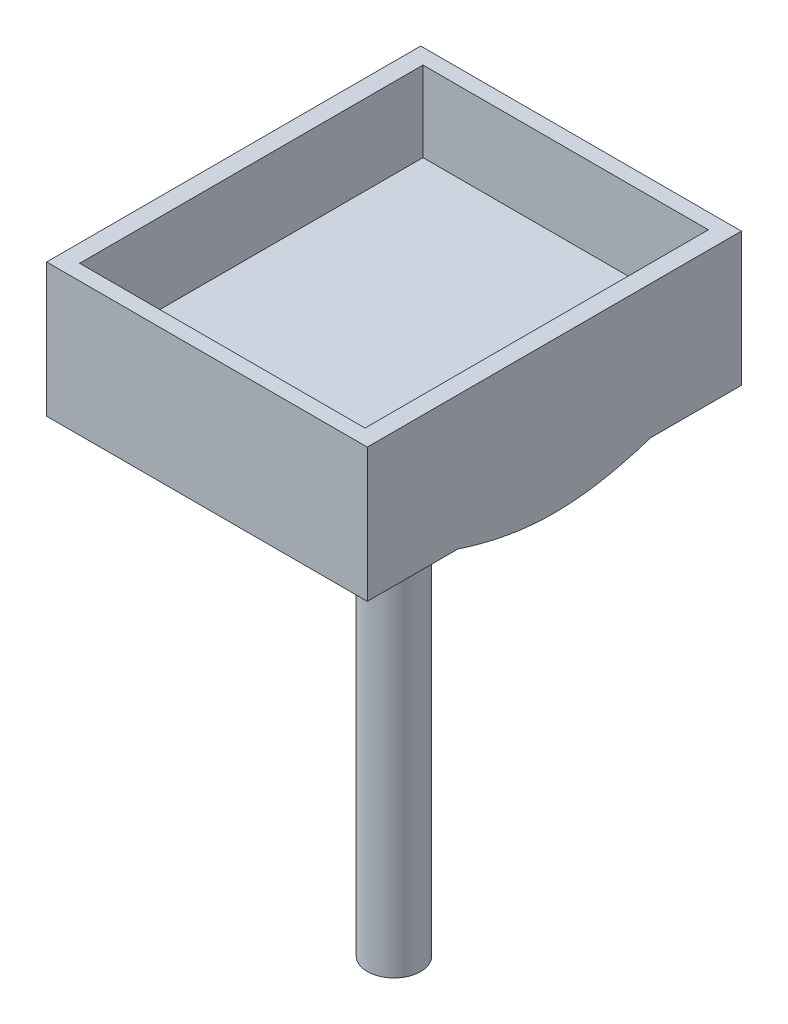
ISO-10303-21;
HEADER;
FILE_DESCRIPTION(('STEP AP214'),'2;1');
FILE_NAME('part.step','',(''),(''),'','','');
FILE_SCHEMA(('AUTOMOTIVE_DESIGN { 1 0 10303 214 1 1 1 1 }'));
ENDSEC;
DATA;
#1=APPLICATION_CONTEXT('core data for automotive mechanical design processes');
#2=APPLICATION_PROTOCOL_DEFINITION('international standard','automotive_design',2000,#1);
#3=PRODUCT_CONTEXT('',#1,'mechanical');
#4=PRODUCT('Part','Part','',(#3));
#5=PRODUCT_RELATED_PRODUCT_CATEGORY('part','',(#4));
#6=PRODUCT_DEFINITION_FORMATION('','',#4);
#7=PRODUCT_DEFINITION_CONTEXT('part definition',#1,'design');
#8=PRODUCT_DEFINITION('design','',#6,#7);
#9=PRODUCT_DEFINITION_SHAPE('','',#8);
#10=(LENGTH_UNIT() NAMED_UNIT(*) SI_UNIT(.MILLI.,.METRE.));
#11=(NAMED_UNIT(*) PLANE_ANGLE_UNIT() SI_UNIT($,.RADIAN.));
#12=(NAMED_UNIT(*) SI_UNIT($,.STERADIAN.) SOLID_ANGLE_UNIT());
#13=UNCERTAINTY_MEASURE_WITH_UNIT(LENGTH_MEASURE(1.E-05),#10,'distance_accuracy_value','');
#14=(GEOMETRIC_REPRESENTATION_CONTEXT(3) GLOBAL_UNCERTAINTY_ASSIGNED_CONTEXT((#13)) GLOBAL_UNIT_ASSIGNED_CONTEXT((#10,
#11,#12)) REPRESENTATION_CONTEXT('',''));
#15=CARTESIAN_POINT('',(0.,0.,0.));
#16=DIRECTION('',(0.,0.,1.));
#17=DIRECTION('',(1.,0.,0.));
#18=AXIS2_PLACEMENT_3D('',#15,#16,#17);
#19=CARTESIAN_POINT('',(0.,90.,0.));
#20=DIRECTION('',(0.,-1.,0.));
#21=DIRECTION('',(0.,0.,-1.));
#22=AXIS2_PLACEMENT_3D('',#19,#20,#21);
#23=CYLINDRICAL_SURFACE('',#22,5.);
#24=CARTESIAN_POINT('',(0.,70.95,0.));
#25=DIRECTION('',(0.,1.,0.));
#26=DIRECTION('',(0.,0.,1.));
#27=AXIS2_PLACEMENT_3D('',#24,#25,#26);
#28=CIRCLE('',#27,5.);
#29=CARTESIAN_POINT('',(0.,70.95,-5.));
#30=VERTEX_POINT('',#29);
#31=EDGE_CURVE('E189',#30,#30,#28,.T.);
#32=CARTESIAN_POINT('',(0.,0.,0.));
#33=DIRECTION('',(0.,1.,0.));
#34=DIRECTION('',(0.,0.,1.));
#35=AXIS2_PLACEMENT_3D('',#32,#33,#34);
#36=CIRCLE('',#35,5.);
#37=CARTESIAN_POINT('',(0.,0.,-5.));
#38=VERTEX_POINT('',#37);
#39=EDGE_CURVE('E234',#38,#38,#36,.T.);
#40=CARTESIAN_POINT('',(0.,70.95,-5.));
#41=CARTESIAN_POINT('',(0.,70.2109375,-5.));
#42=CARTESIAN_POINT('',(0.,69.471875,-5.));
#43=CARTESIAN_POINT('',(0.,67.99375,-5.));
#44=CARTESIAN_POINT('',(0.,67.2546875,-5.));
#45=CARTESIAN_POINT('',(0.,65.7765625,-5.));
#46=CARTESIAN_POINT('',(0.,65.0375,-5.));
#47=CARTESIAN_POINT('',(0.,63.559375,-5.));
#48=CARTESIAN_POINT('',(0.,62.8203125,-5.));
#49=CARTESIAN_POINT('',(0.,61.3421875,-5.));
#50=CARTESIAN_POINT('',(0.,60.603125,-5.));
#51=CARTESIAN_POINT('',(0.,59.125,-5.));
#52=CARTESIAN_POINT('',(0.,58.3859375,-5.));
#53=CARTESIAN_POINT('',(0.,56.9078125,-5.));
#54=CARTESIAN_POINT('',(0.,56.16875,-5.));
#55=CARTESIAN_POINT('',(0.,54.690625,-5.));
#56=CARTESIAN_POINT('',(0.,53.9515625,-5.));
#57=CARTESIAN_POINT('',(0.,52.4734375,-5.));
#58=CARTESIAN_POINT('',(0.,51.734375,-5.));
#59=CARTESIAN_POINT('',(0.,50.25625,-5.));
#60=CARTESIAN_POINT('',(0.,49.5171875,-5.));
#61=CARTESIAN_POINT('',(0.,48.0390625,-5.));
#62=CARTESIAN_POINT('',(0.,47.3,-5.));
#63=CARTESIAN_POINT('',(0.,45.821875,-5.));
#64=CARTESIAN_POINT('',(0.,45.0828125,-5.));
#65=CARTESIAN_POINT('',(0.,43.6046875,-5.));
#66=CARTESIAN_POINT('',(0.,42.865625,-5.));
#67=CARTESIAN_POINT('',(0.,41.3875,-5.));
#68=CARTESIAN_POINT('',(0.,40.6484375,-5.));
#69=CARTESIAN_POINT('',(0.,39.1703125,-5.));
#70=CARTESIAN_POINT('',(0.,38.43125,-5.));
#71=CARTESIAN_POINT('',(0.,36.953125,-5.));
#72=CARTESIAN_POINT('',(0.,36.2140625,-5.));
#73=CARTESIAN_POINT('',(0.,34.7359375,-5.));
#74=CARTESIAN_POINT('',(0.,33.996875,-5.));
#75=CARTESIAN_POINT('',(0.,32.51875,-5.));
#76=CARTESIAN_POINT('',(0.,31.7796875,-5.));
#77=CARTESIAN_POINT('',(0.,30.3015625,-5.));
#78=CARTESIAN_POINT('',(0.,29.5625,-5.));
#79=CARTESIAN_POINT('',(0.,28.084375,-5.));
#80=CARTESIAN_POINT('',(0.,27.3453125,-5.));
#81=CARTESIAN_POINT('',(0.,25.8671875,-5.));
#82=CARTESIAN_POINT('',(0.,25.128125,-5.));
#83=CARTESIAN_POINT('',(0.,23.65,-5.));
#84=CARTESIAN_POINT('',(0.,22.9109375,-5.));
#85=CARTESIAN_POINT('',(0.,21.4328125,-5.));
#86=CARTESIAN_POINT('',(0.,20.69375,-5.));
#87=CARTESIAN_POINT('',(0.,19.215625,-5.));
#88=CARTESIAN_POINT('',(0.,18.4765625,-5.));
#89=CARTESIAN_POINT('',(0.,16.9984375,-5.));
#90=CARTESIAN_POINT('',(0.,16.259375,-5.));
#91=CARTESIAN_POINT('',(0.,14.78125,-5.));
#92=CARTESIAN_POINT('',(0.,14.0421875,-5.));
#93=CARTESIAN_POINT('',(0.,12.5640625,-5.));
#94=CARTESIAN_POINT('',(0.,11.825,-5.));
#95=CARTESIAN_POINT('',(0.,10.346875,-5.));
#96=CARTESIAN_POINT('',(0.,9.60781249999999,-5.));
#97=CARTESIAN_POINT('',(0.,8.1296875,-5.));
#98=CARTESIAN_POINT('',(0.,7.390625,-5.));
#99=CARTESIAN_POINT('',(0.,5.9125,-5.));
#100=CARTESIAN_POINT('',(0.,5.1734375,-5.));
#101=CARTESIAN_POINT('',(0.,3.6953125,-5.));
#102=CARTESIAN_POINT('',(0.,2.95624999999999,-5.));
#103=CARTESIAN_POINT('',(0.,1.47812499999998,-5.));
#104=CARTESIAN_POINT('',(0.,0.739062499999984,-5.));
#105=CARTESIAN_POINT('',(0.,0.,-5.));
#106=B_SPLINE_CURVE_WITH_KNOTS('',3,(#40,#41,#42,#43,#44,#45,#46,#47,#48,#49,#50,#51,#52,#53,
#54,#55,#56,#57,#58,#59,#60,#61,#62,#63,#64,#65,#66,#67,#68,#69,#70,#71,#72,#73,#74,#75,#76,#77,
#78,#79,#80,#81,#82,#83,#84,#85,#86,#87,#88,#89,#90,#91,#92,#93,#94,#95,#96,#97,#98,#99,#100,
#101,#102,#103,#104,#105),.UNSPECIFIED.,.F.,.F.,(4,2,2,2,2,2,2,2,2,2,2,2,2,2,2,2,2,2,2,2,2,2,2,
2,2,2,2,2,2,2,2,2,4),(0.,2.21718750000001,4.434375,6.6515625,8.86875000000001,11.0859375,
13.303125,15.5203125,17.7375,19.9546875,22.171875,24.3890625,26.60625,28.8234375,31.040625,
33.2578125,35.475,37.6921875,39.909375,42.1265625,44.34375,46.5609375,48.778125,50.9953125,
53.2125,55.4296875,57.646875,59.8640625,62.08125,64.2984375,66.515625,68.7328125,70.95),.UNSPECIFIED.);
#107=EDGE_CURVE('BSEAM44',#30,#38,#106,.T.);
#108=ORIENTED_EDGE('',*,*,#31,.F.);
#109=ORIENTED_EDGE('',*,*,#39,.T.);
#110=ORIENTED_EDGE('',*,*,#107,.T.);
#111=ORIENTED_EDGE('',*,*,#107,.F.);
#112=EDGE_LOOP('',(#108,#110,#109,#111));
#113=FACE_BOUND('',#112,.T.);
#114=ADVANCED_FACE('F44',(#113),#23,.T.);
#115=CARTESIAN_POINT('',(0.,0.,0.));
#116=DIRECTION('',(0.,1.,0.));
#117=DIRECTION('',(0.,0.,1.));
#118=AXIS2_PLACEMENT_3D('',#115,#116,#117);
#119=PLANE('',#118);
#120=ORIENTED_EDGE('',*,*,#39,.F.);
#121=EDGE_LOOP('',(#120));
#122=FACE_BOUND('',#121,.T.);
#123=ADVANCED_FACE('F276',(#122),#119,.F.);
#124=CARTESIAN_POINT('',(0.,90.,0.));
#125=DIRECTION('',(0.,1.,0.));
#126=DIRECTION('',(0.,0.,1.));
#127=AXIS2_PLACEMENT_3D('',#124,#125,#126);
#128=CONICAL_SURFACE('',#127,35.,1.00503829705281);
#129=CARTESIAN_POINT('',(-30.,138.673982891939,-107.546064802896));
#130=CARTESIAN_POINT('',(-30.,137.373767080057,-105.420227630996));
#131=CARTESIAN_POINT('',(-30.,136.075506407321,-103.293191662438));
#132=CARTESIAN_POINT('',(-30.,133.483819119817,-99.0361621358405));
#133=CARTESIAN_POINT('',(-30.,132.190392530082,-96.9061685625646));
#134=CARTESIAN_POINT('',(-30.,129.608933581953,-92.6420629487055));
#135=CARTESIAN_POINT('',(-30.,128.320902910074,-90.5079498866202));
#136=CARTESIAN_POINT('',(-30.,125.751884310078,-86.2354923701299));
#137=CARTESIAN_POINT('',(-30.,124.470896369152,-84.0971479234298));
#138=CARTESIAN_POINT('',(-30.,121.911755671328,-79.8054917864776));
#139=CARTESIAN_POINT('',(-30.,120.633642672995,-77.6521563703064));
#140=CARTESIAN_POINT('',(-30.,118.088388741257,-73.3390142348211));
#141=CARTESIAN_POINT('',(-30.,116.821247778676,-71.1792075327357));
#142=CARTESIAN_POINT('',(-30.,114.301150597366,-66.8518468219174));
#143=CARTESIAN_POINT('',(-30.,113.048191832849,-64.6842942985533));
#144=CARTESIAN_POINT('',(-30.,111.18239857315,-61.425163097025));
#145=CARTESIAN_POINT('',(-30.,110.562743253998,-60.3374885118703));
#146=CARTESIAN_POINT('',(-30.,109.328684553185,-58.1591648814117));
#147=CARTESIAN_POINT('',(-30.,108.714281163685,-57.0685158405509));
#148=CARTESIAN_POINT('',(-30.,107.299721209316,-54.5411103914377));
#149=CARTESIAN_POINT('',(-30.,106.501763644601,-53.103121481933));
#150=CARTESIAN_POINT('',(-30.,104.918620288696,-50.2201099023198));
#151=CARTESIAN_POINT('',(-30.,104.133434566112,-48.7750871944824));
#152=CARTESIAN_POINT('',(-30.,102.578546521247,-45.8759215035246));
#153=CARTESIAN_POINT('',(-30.,101.808851016936,-44.4217748585942));
#154=CARTESIAN_POINT('',(-30.,100.289301586826,-41.5031363796143));
#155=CARTESIAN_POINT('',(-30.,99.5394473915369,-40.0386446864158));
#156=CARTESIAN_POINT('',(-30.,98.4326839161197,-37.8304743921339));
#157=CARTESIAN_POINT('',(-30.,98.0662997976447,-37.0915411602742));
#158=CARTESIAN_POINT('',(-30.,97.3407725616416,-35.6101312234868));
#159=CARTESIAN_POINT('',(-30.,96.9816293821811,-34.8676545489336));
#160=CARTESIAN_POINT('',(-30.,96.2715481157527,-33.3787015052499));
#161=CARTESIAN_POINT('',(-30.,95.9206107712966,-32.6322247816259));
#162=CARTESIAN_POINT('',(-30.,95.2281546953222,-31.1349115943893));
#163=CARTESIAN_POINT('',(-30.,94.8866359393919,-30.3840751420828));
#164=CARTESIAN_POINT('',(-30.,94.2145879741199,-28.8779996527615));
#165=CARTESIAN_POINT('',(-30.,93.8840526759384,-28.1227633373314));
#166=CARTESIAN_POINT('',(-30.,93.2353864566478,-26.6069605863383));
#167=CARTESIAN_POINT('',(-30.,92.9172556902603,-25.8463940844314));
#168=CARTESIAN_POINT('',(-30.,92.2953518051474,-24.3195425653464));
#169=CARTESIAN_POINT('',(-30.,91.9915763720509,-23.5532584931813));
#170=CARTESIAN_POINT('',(-30.,91.400555795113,-22.0143614398676));
#171=CARTESIAN_POINT('',(-30.,91.1133099645154,-21.2417487231814));
#172=CARTESIAN_POINT('',(-30.,90.5444686320344,-19.6521515715014));
#173=CARTESIAN_POINT('',(-30.,90.2638176122865,-18.834827725387));
#174=CARTESIAN_POINT('',(-30.,89.7268654950292,-17.1921912632238));
#175=CARTESIAN_POINT('',(-30.,89.4705642120038,-16.3668787080921));
#176=CARTESIAN_POINT('',(-30.,88.9861192320895,-14.7080013730931));
#177=CARTESIAN_POINT('',(-30.,88.7579750269567,-13.8744367424716));
#178=CARTESIAN_POINT('',(-30.,88.3339775950481,-12.1990833924805));
#179=CARTESIAN_POINT('',(-30.,88.1381242674443,-11.357294698799));
#180=CARTESIAN_POINT('',(-30.,87.7850754199941,-9.67592676732105));
#181=CARTESIAN_POINT('',(-30.,87.627452413333,-8.83643794148996));
#182=CARTESIAN_POINT('',(-30.,87.3518856464695,-7.1509322859886));
#183=CARTESIAN_POINT('',(-30.,87.233941186104,-6.3049155717782));
#184=CARTESIAN_POINT('',(-30.,87.0411527273799,-4.60824286170311));
#185=CARTESIAN_POINT('',(-30.,86.9662934778702,-3.75758861518255));
#186=CARTESIAN_POINT('',(-30.,86.8619811824506,-2.0534800256));
#187=CARTESIAN_POINT('',(-30.,86.8325277791628,-1.20002570462966));
#188=CARTESIAN_POINT('',(-30.,86.819960595158,0.514235974965454));
#189=CARTESIAN_POINT('',(-30.,86.8372291496917,1.37504618969294));
#190=CARTESIAN_POINT('',(-30.,86.9183332568906,3.09445456408258));
#191=CARTESIAN_POINT('',(-30.,86.982169251922,3.95305270265343));
#192=CARTESIAN_POINT('',(-30.,87.1543422034353,5.66599994548119));
#193=CARTESIAN_POINT('',(-30.,87.2626929047508,6.52034765479255));
#194=CARTESIAN_POINT('',(-30.,87.5206422729315,8.22275296406229));
#195=CARTESIAN_POINT('',(-30.,87.6702417291997,9.07081044332166));
#196=CARTESIAN_POINT('',(-30.,88.0088061100727,10.769867027638));
#197=CARTESIAN_POINT('',(-30.,88.1982343742976,11.6207731172736));
#198=CARTESIAN_POINT('',(-30.,88.6109233998695,13.3142891867518));
#199=CARTESIAN_POINT('',(-30.,88.8341845573266,14.1568990693405));
#200=CARTESIAN_POINT('',(-30.,89.3102460858606,15.8337176797129));
#201=CARTESIAN_POINT('',(-30.,89.5630471159211,16.667926219626));
#202=CARTESIAN_POINT('',(-30.,89.9613974359033,17.9130324447111));
#203=CARTESIAN_POINT('',(-30.,90.0973705826754,18.3270284657605));
#204=CARTESIAN_POINT('',(-30.,90.3752534112985,19.1530266681292));
#205=CARTESIAN_POINT('',(-30.,90.5171631180277,19.5650288410849));
#206=CARTESIAN_POINT('',(-30.,90.9300037728857,20.7380701544529));
#207=CARTESIAN_POINT('',(-30.,91.2076373284959,21.4967555419285));
#208=CARTESIAN_POINT('',(-30.,91.7793179556847,23.0079372823433));
#209=CARTESIAN_POINT('',(-30.,92.0733659480234,23.7604332853698));
#210=CARTESIAN_POINT('',(-30.,92.6757715016487,25.2598555566361));
#211=CARTESIAN_POINT('',(-30.,92.9841321786235,26.0067805706795));
#212=CARTESIAN_POINT('',(-30.,93.6132345618857,27.4953724681398));
#213=CARTESIAN_POINT('',(-30.,93.9339760668325,28.2370394368325));
#214=CARTESIAN_POINT('',(-30.,94.5865486740753,29.7162832968331));
#215=CARTESIAN_POINT('',(-30.,94.9183896779142,30.4538558127956));
#216=CARTESIAN_POINT('',(-30.,95.5915157609574,31.9246755314862));
#217=CARTESIAN_POINT('',(-30.,95.9328008743814,32.6579227185303));
#218=CARTESIAN_POINT('',(-30.,96.6236073371594,34.1204266929669));
#219=CARTESIAN_POINT('',(-30.,96.9731278012806,34.8496838989595));
#220=CARTESIAN_POINT('',(-30.,97.6794494374746,36.3046668029561));
#221=CARTESIAN_POINT('',(-30.,98.0362506747167,37.0303924692776));
#222=CARTESIAN_POINT('',(-30.,99.1182250744464,39.2067517808444));
#223=CARTESIAN_POINT('',(-30.,99.8530733837692,40.6525792914777));
#224=CARTESIAN_POINT('',(-30.,101.342975423737,43.5337771462784));
#225=CARTESIAN_POINT('',(-30.,102.098029522899,44.969147299114));
#226=CARTESIAN_POINT('',(-30.,103.623874357831,47.8305441746947));
#227=CARTESIAN_POINT('',(-30.,104.394656852996,49.2565752980922));
#228=CARTESIAN_POINT('',(-30.,105.949232868956,52.1015032032319));
#229=CARTESIAN_POINT('',(-30.,106.733026297119,53.5204000356735));
#230=CARTESIAN_POINT('',(-30.,108.312416723175,56.3543217551546));
#231=CARTESIAN_POINT('',(-30.,109.108029300827,57.7693379500682));
#232=CARTESIAN_POINT('',(-30.,110.70808833097,60.5943646793998));
#233=CARTESIAN_POINT('',(-30.,111.512534793968,62.0043752078616));
#234=CARTESIAN_POINT('',(-30.,113.128898111183,64.820315777407));
#235=CARTESIAN_POINT('',(-30.,113.940815795192,66.2262453418594));
#236=CARTESIAN_POINT('',(-30.,115.570875013679,69.0344886251501));
#237=CARTESIAN_POINT('',(-30.,116.389016544384,70.4368023461797));
#238=CARTESIAN_POINT('',(-30.,118.029405342153,73.2363033602978));
#239=CARTESIAN_POINT('',(-30.,118.851644967156,74.6334951331697));
#240=CARTESIAN_POINT('',(-30.,120.500653448375,77.4252040307897));
#241=CARTESIAN_POINT('',(-30.,121.32742230948,78.8197211526492));
#242=CARTESIAN_POINT('',(-30.,123.813510572198,82.9997124156217));
#243=CARTESIAN_POINT('',(-30.,125.47866490596,85.7817171394603));
#244=CARTESIAN_POINT('',(-30.,128.104916287672,90.1483694792077));
#245=CARTESIAN_POINT('',(-30.,129.062041832029,91.7354101985785));
#246=CARTESIAN_POINT('',(-30.,130.979880129824,94.9078556416213));
#247=CARTESIAN_POINT('',(-30.,131.940593706714,96.493259867635));
#248=CARTESIAN_POINT('',(-30.,133.862094328056,99.6576405827623));
#249=CARTESIAN_POINT('',(-30.,134.822872836017,101.236622257481));
#250=CARTESIAN_POINT('',(-30.,136.74673075746,104.392647353121));
#251=CARTESIAN_POINT('',(-30.,137.709809542568,105.969691157057));
#252=CARTESIAN_POINT('',(-30.,138.673982891939,107.546064802896));
#253=B_SPLINE_CURVE_WITH_KNOTS('',3,(#129,#130,#131,#132,#133,#134,#135,#136,#137,#138,#139,
#140,#141,#142,#143,#144,#145,#146,#147,#148,#149,#150,#151,#152,#153,#154,#155,#156,#157,#158,
#159,#160,#161,#162,#163,#164,#165,#166,#167,#168,#169,#170,#171,#172,#173,#174,#175,#176,#177,
#178,#179,#180,#181,#182,#183,#184,#185,#186,#187,#188,#189,#190,#191,#192,#193,#194,#195,#196,
#197,#198,#199,#200,#201,#202,#203,#204,#205,#206,#207,#208,#209,#210,#211,#212,#213,#214,#215,
#216,#217,#218,#219,#220,#221,#222,#223,#224,#225,#226,#227,#228,#229,#230,#231,#232,#233,#234,
#235,#236,#237,#238,#239,#240,#241,#242,#243,#244,#245,#246,#247,#248,#249,#250,#251,#252),
.UNSPECIFIED.,.F.,.F.,(4,2,2,2,2,2,2,2,2,2,2,2,2,2,2,2,2,2,2,2,2,2,2,2,2,2,2,2,2,2,2,2,2,2,2,2,
2,2,2,2,2,2,2,2,2,2,2,2,2,2,2,2,2,2,2,2,2,2,2,2,2,4),(0.,7.47581062568457,14.951659907773,
22.4296934938279,29.9077134755251,37.4199329238096,44.932132389725,52.4429612749093,
56.19835586837,59.9537448552788,64.8873451287647,69.8209718951688,74.756724678917,
79.6924103899499,82.1667143389763,84.6409971161309,87.1155029211449,89.5900023118848,
92.0631062316485,94.5362409885485,97.0089756560597,99.4816075144716,102.073775418383,
104.665923571482,107.258024928674,109.850118191898,112.411731708521,114.973300020834,
117.533961039672,120.094601904101,122.676260252566,125.257943125743,127.840423746567,
130.422953793351,133.03737760614,135.651832030548,138.26634479006,139.573569632637,
140.880799953908,143.304226348851,145.727788821621,148.151881370158,150.575934514016,
153.002210997089,155.428496272623,157.854521921547,160.2805692951,165.145909882523,
170.011339265599,174.874281818126,179.737189763408,184.607206388415,189.477228806296,
194.347798803858,199.218365849041,204.081894193652,208.945427787746,218.672179485708,
224.232130769519,229.793447873189,235.338398703333,240.881977063949),.UNSPECIFIED.);
#254=CARTESIAN_POINT('',(-30.,90.,-18.0277563773199));
#255=VERTEX_POINT('',#254);
#256=CARTESIAN_POINT('',(-30.,90.,18.02775637732));
#257=VERTEX_POINT('',#256);
#258=EDGE_CURVE('E11',#255,#257,#253,.T.);
#259=ORIENTED_EDGE('',*,*,#258,.F.);
#260=CARTESIAN_POINT('',(0.,90.,0.));
#261=DIRECTION('',(0.,-1.,0.));
#262=DIRECTION('',(0.,0.,-1.));
#263=AXIS2_PLACEMENT_3D('',#260,#261,#262);
#264=CIRCLE('',#263,35.);
#265=CARTESIAN_POINT('',(0.,90.,-35.));
#266=VERTEX_POINT('',#265);
#267=EDGE_CURVE('E249',#255,#266,#264,.T.);
#268=ORIENTED_EDGE('',*,*,#267,.T.);
#269=CARTESIAN_POINT('',(30.,90.,-18.02775637732));
#270=VERTEX_POINT('',#269);
#271=EDGE_CURVE('E248',#266,#270,#264,.T.);
#272=ORIENTED_EDGE('',*,*,#271,.T.);
#273=CARTESIAN_POINT('',(30.,138.673982891939,107.546064802896));
#274=CARTESIAN_POINT('',(30.,137.373767080057,105.420227630996));
#275=CARTESIAN_POINT('',(30.,136.075506407321,103.293191662438));
#276=CARTESIAN_POINT('',(30.,133.483819119817,99.0361621358405));
#277=CARTESIAN_POINT('',(30.,132.190392530082,96.9061685625646));
#278=CARTESIAN_POINT('',(30.,129.608933581953,92.6420629487055));
#279=CARTESIAN_POINT('',(30.,128.320902910074,90.5079498866203));
#280=CARTESIAN_POINT('',(30.,125.751884310078,86.2354923701299));
#281=CARTESIAN_POINT('',(30.,124.470896369152,84.0971479234299));
#282=CARTESIAN_POINT('',(30.,121.911755671328,79.8054917864776));
#283=CARTESIAN_POINT('',(30.,120.633642672995,77.6521563703065));
#284=CARTESIAN_POINT('',(30.,118.088388741257,73.3390142348211));
#285=CARTESIAN_POINT('',(30.,116.821247778676,71.1792075327358));
#286=CARTESIAN_POINT('',(30.,114.301150597366,66.8518468219174));
#287=CARTESIAN_POINT('',(30.,113.048191832849,64.6842942985533));
#288=CARTESIAN_POINT('',(30.,111.18239857315,61.425163097025));
#289=CARTESIAN_POINT('',(30.,110.562743253998,60.3374885118703));
#290=CARTESIAN_POINT('',(30.,109.328684553185,58.1591648814117));
#291=CARTESIAN_POINT('',(30.,108.714281163685,57.0685158405509));
#292=CARTESIAN_POINT('',(30.,107.299721209316,54.5411103914377));
#293=CARTESIAN_POINT('',(30.,106.501763644601,53.103121481933));
#294=CARTESIAN_POINT('',(30.,104.918620288696,50.2201099023198));
#295=CARTESIAN_POINT('',(30.,104.133434566112,48.7750871944824));
#296=CARTESIAN_POINT('',(30.,102.578546521247,45.8759215035246));
#297=CARTESIAN_POINT('',(30.,101.808851016936,44.4217748585941));
#298=CARTESIAN_POINT('',(30.,100.289301586826,41.5031363796143));
#299=CARTESIAN_POINT('',(30.,99.5394473915369,40.0386446864158));
#300=CARTESIAN_POINT('',(30.,98.4326839161197,37.8304743921338));
#301=CARTESIAN_POINT('',(30.,98.0662997976447,37.0915411602742));
#302=CARTESIAN_POINT('',(30.,97.3407725616416,35.6101312234868));
#303=CARTESIAN_POINT('',(30.,96.9816293821811,34.8676545489336));
#304=CARTESIAN_POINT('',(30.,96.2715481157527,33.3787015052499));
#305=CARTESIAN_POINT('',(30.,95.9206107712966,32.6322247816259));
#306=CARTESIAN_POINT('',(30.,95.2281546953222,31.1349115943893));
#307=CARTESIAN_POINT('',(30.,94.8866359393919,30.3840751420827));
#308=CARTESIAN_POINT('',(30.,94.2145879741199,28.8779996527614));
#309=CARTESIAN_POINT('',(30.,93.8840526759384,28.1227633373314));
#310=CARTESIAN_POINT('',(30.,93.2353864566477,26.6069605863382));
#311=CARTESIAN_POINT('',(30.,92.9172556902603,25.8463940844313));
#312=CARTESIAN_POINT('',(30.,92.2953518051474,24.3195425653464));
#313=CARTESIAN_POINT('',(30.,91.9915763720509,23.5532584931812));
#314=CARTESIAN_POINT('',(30.,91.4005557951129,22.0143614398676));
#315=CARTESIAN_POINT('',(30.,91.1133099645154,21.2417487231813));
#316=CARTESIAN_POINT('',(30.,90.5444686320344,19.6521515715014));
#317=CARTESIAN_POINT('',(30.,90.2638176122865,18.834827725387));
#318=CARTESIAN_POINT('',(30.,89.7268654950292,17.1921912632237));
#319=CARTESIAN_POINT('',(30.,89.4705642120038,16.366878708092));
#320=CARTESIAN_POINT('',(30.,88.9861192320895,14.708001373093));
#321=CARTESIAN_POINT('',(30.,88.7579750269567,13.8744367424716));
#322=CARTESIAN_POINT('',(30.,88.3339775950481,12.1990833924805));
#323=CARTESIAN_POINT('',(30.,88.1381242674442,11.357294698799));
#324=CARTESIAN_POINT('',(30.,87.7850754199941,9.67592676732102));
#325=CARTESIAN_POINT('',(30.,87.627452413333,8.83643794148993));
#326=CARTESIAN_POINT('',(30.,87.3518856464695,7.15093228598856));
#327=CARTESIAN_POINT('',(30.,87.233941186104,6.30491557177817));
#328=CARTESIAN_POINT('',(30.,87.0411527273799,4.60824286170308));
#329=CARTESIAN_POINT('',(30.,86.9662934778702,3.75758861518252));
#330=CARTESIAN_POINT('',(30.,86.8619811824506,2.05348002559997));
#331=CARTESIAN_POINT('',(30.,86.8325277791628,1.20002570462963));
#332=CARTESIAN_POINT('',(30.,86.819960595158,-0.514235974965491));
#333=CARTESIAN_POINT('',(30.,86.8372291496917,-1.37504618969298));
#334=CARTESIAN_POINT('',(30.,86.9183332568906,-3.09445456408263));
#335=CARTESIAN_POINT('',(30.,86.982169251922,-3.95305270265347));
#336=CARTESIAN_POINT('',(30.,87.1543422034353,-5.66599994548123));
#337=CARTESIAN_POINT('',(30.,87.2626929047508,-6.52034765479259));
#338=CARTESIAN_POINT('',(30.,87.5206422729315,-8.22275296406233));
#339=CARTESIAN_POINT('',(30.,87.6702417291997,-9.0708104433217));
#340=CARTESIAN_POINT('',(30.,88.0088061100727,-10.769867027638));
#341=CARTESIAN_POINT('',(30.,88.1982343742977,-11.6207731172737));
#342=CARTESIAN_POINT('',(30.,88.6109233998695,-13.3142891867518));
#343=CARTESIAN_POINT('',(30.,88.8341845573266,-14.1568990693406));
#344=CARTESIAN_POINT('',(30.,89.3102460858606,-15.833717679713));
#345=CARTESIAN_POINT('',(30.,89.5630471159211,-16.6679262196261));
#346=CARTESIAN_POINT('',(30.,89.9613974359034,-17.9130324447111));
#347=CARTESIAN_POINT('',(30.,90.0973705826755,-18.3270284657606));
#348=CARTESIAN_POINT('',(30.,90.3752534112985,-19.1530266681293));
#349=CARTESIAN_POINT('',(30.,90.5171631180277,-19.5650288410849));
#350=CARTESIAN_POINT('',(30.,90.9300037728857,-20.7380701544529));
#351=CARTESIAN_POINT('',(30.,91.2076373284959,-21.4967555419286));
#352=CARTESIAN_POINT('',(30.,91.7793179556847,-23.0079372823433));
#353=CARTESIAN_POINT('',(30.,92.0733659480234,-23.7604332853698));
#354=CARTESIAN_POINT('',(30.,92.6757715016487,-25.2598555566362));
#355=CARTESIAN_POINT('',(30.,92.9841321786236,-26.0067805706796));
#356=CARTESIAN_POINT('',(30.,93.6132345618857,-27.4953724681399));
#357=CARTESIAN_POINT('',(30.,93.9339760668325,-28.2370394368326));
#358=CARTESIAN_POINT('',(30.,94.5865486740753,-29.7162832968332));
#359=CARTESIAN_POINT('',(30.,94.9183896779142,-30.4538558127957));
#360=CARTESIAN_POINT('',(30.,95.5915157609575,-31.9246755314863));
#361=CARTESIAN_POINT('',(30.,95.9328008743814,-32.6579227185304));
#362=CARTESIAN_POINT('',(30.,96.6236073371594,-34.120426692967));
#363=CARTESIAN_POINT('',(30.,96.9731278012807,-34.8496838989596));
#364=CARTESIAN_POINT('',(30.,97.6794494374746,-36.3046668029562));
#365=CARTESIAN_POINT('',(30.,98.0362506747167,-37.0303924692777));
#366=CARTESIAN_POINT('',(30.,99.1182250744464,-39.2067517808445));
#367=CARTESIAN_POINT('',(30.,99.8530733837693,-40.6525792914778));
#368=CARTESIAN_POINT('',(30.,101.342975423737,-43.5337771462785));
#369=CARTESIAN_POINT('',(30.,102.098029522899,-44.9691472991142));
#370=CARTESIAN_POINT('',(30.,103.623874357831,-47.8305441746948));
#371=CARTESIAN_POINT('',(30.,104.394656852996,-49.2565752980923));
#372=CARTESIAN_POINT('',(30.,105.949232868956,-52.101503203232));
#373=CARTESIAN_POINT('',(30.,106.733026297119,-53.5204000356736));
#374=CARTESIAN_POINT('',(30.,108.312416723175,-56.3543217551548));
#375=CARTESIAN_POINT('',(30.,109.108029300827,-57.7693379500684));
#376=CARTESIAN_POINT('',(30.,110.70808833097,-60.5943646794));
#377=CARTESIAN_POINT('',(30.,111.512534793968,-62.0043752078617));
#378=CARTESIAN_POINT('',(30.,113.128898111183,-64.8203157774072));
#379=CARTESIAN_POINT('',(30.,113.940815795192,-66.2262453418596));
#380=CARTESIAN_POINT('',(30.,115.570875013679,-69.0344886251503));
#381=CARTESIAN_POINT('',(30.,116.389016544384,-70.4368023461799));
#382=CARTESIAN_POINT('',(30.,118.029405342153,-73.236303360298));
#383=CARTESIAN_POINT('',(30.,118.851644967156,-74.6334951331699));
#384=CARTESIAN_POINT('',(30.,120.500653448375,-77.4252040307899));
#385=CARTESIAN_POINT('',(30.,121.32742230948,-78.8197211526494));
#386=CARTESIAN_POINT('',(30.,123.813510572198,-82.9997124156219));
#387=CARTESIAN_POINT('',(30.,125.47866490596,-85.7817171394606));
#388=CARTESIAN_POINT('',(30.,128.104916287672,-90.1483694792079));
#389=CARTESIAN_POINT('',(30.,129.062041832029,-91.7354101985787));
#390=CARTESIAN_POINT('',(30.,130.979880129824,-94.9078556416215));
#391=CARTESIAN_POINT('',(30.,131.940593706714,-96.4932598676351));
#392=CARTESIAN_POINT('',(30.,133.862094328056,-99.6576405827624));
#393=CARTESIAN_POINT('',(30.,134.822872836017,-101.236622257481));
#394=CARTESIAN_POINT('',(30.,136.74673075746,-104.392647353121));
#395=CARTESIAN_POINT('',(30.,137.709809542568,-105.969691157057));
#396=CARTESIAN_POINT('',(30.,138.673982891939,-107.546064802896));
#397=B_SPLINE_CURVE_WITH_KNOTS('',3,(#273,#274,#275,#276,#277,#278,#279,#280,#281,#282,#283,
#284,#285,#286,#287,#288,#289,#290,#291,#292,#293,#294,#295,#296,#297,#298,#299,#300,#301,#302,
#303,#304,#305,#306,#307,#308,#309,#310,#311,#312,#313,#314,#315,#316,#317,#318,#319,#320,#321,
#322,#323,#324,#325,#326,#327,#328,#329,#330,#331,#332,#333,#334,#335,#336,#337,#338,#339,#340,
#341,#342,#343,#344,#345,#346,#347,#348,#349,#350,#351,#352,#353,#354,#355,#356,#357,#358,#359,
#360,#361,#362,#363,#364,#365,#366,#367,#368,#369,#370,#371,#372,#373,#374,#375,#376,#377,#378,
#379,#380,#381,#382,#383,#384,#385,#386,#387,#388,#389,#390,#391,#392,#393,#394,#395,#396),
.UNSPECIFIED.,.F.,.F.,(4,2,2,2,2,2,2,2,2,2,2,2,2,2,2,2,2,2,2,2,2,2,2,2,2,2,2,2,2,2,2,2,2,2,2,2,
2,2,2,2,2,2,2,2,2,2,2,2,2,2,2,2,2,2,2,2,2,2,2,2,2,4),(0.,7.47581062568457,14.9516599077729,
22.4296934938278,29.9077134755251,37.4199329238095,44.932132389725,52.4429612749093,
56.19835586837,59.9537448552788,64.8873451287647,69.8209718951688,74.7567246789171,
79.69241038995,82.1667143389764,84.640997116131,87.115502921145,89.5900023118849,
92.0631062316486,94.5362409885486,97.0089756560598,99.4816075144717,102.073775418384,
104.665923571482,107.258024928674,109.850118191898,112.411731708521,114.973300020834,
117.533961039672,120.094601904101,122.676260252566,125.257943125743,127.840423746568,
130.422953793351,133.03737760614,135.651832030548,138.26634479006,139.573569632637,
140.880799953908,143.304226348851,145.727788821621,148.151881370158,150.575934514016,
153.002210997089,155.428496272623,157.854521921547,160.2805692951,165.145909882523,
170.011339265599,174.874281818126,179.737189763408,184.607206388415,189.477228806296,
194.347798803858,199.218365849041,204.081894193652,208.945427787746,218.672179485708,
224.232130769519,229.793447873189,235.338398703333,240.881977063949),.UNSPECIFIED.);
#398=CARTESIAN_POINT('',(30.,90.,18.0277563773199));
#399=VERTEX_POINT('',#398);
#400=EDGE_CURVE('E56',#399,#270,#397,.T.);
#401=ORIENTED_EDGE('',*,*,#400,.F.);
#402=CARTESIAN_POINT('',(0.,90.,0.));
#403=DIRECTION('',(0.,1.,0.));
#404=DIRECTION('',(0.,0.,1.));
#405=AXIS2_PLACEMENT_3D('',#402,#403,#404);
#406=CIRCLE('',#405,35.);
#407=CARTESIAN_POINT('',(0.,90.,35.));
#408=VERTEX_POINT('',#407);
#409=EDGE_CURVE('E178',#408,#399,#406,.T.);
#410=ORIENTED_EDGE('',*,*,#409,.F.);
#411=EDGE_CURVE('E74',#408,#257,#264,.T.);
#412=ORIENTED_EDGE('',*,*,#411,.T.);
#413=EDGE_LOOP('',(#259,#268,#272,#401,#410,#412));
#414=FACE_BOUND('',#413,.T.);
#415=ORIENTED_EDGE('',*,*,#31,.T.);
#416=EDGE_LOOP('',(#415));
#417=FACE_BOUND('',#416,.T.);
#418=ADVANCED_FACE('F258',(#414,#417),#128,.T.);
#419=CARTESIAN_POINT('',(0.,115.,0.));
#420=DIRECTION('',(0.,-1.,0.));
#421=DIRECTION('',(0.,0.,-1.));
#422=AXIS2_PLACEMENT_3D('',#419,#420,#421);
#423=PLANE('',#422);
#424=DIRECTION('',(-1.,0.,0.));
#425=VECTOR('',#424,1.);
#426=CARTESIAN_POINT('',(0.,115.,-32.125000008));
#427=LINE('',#426,#425);
#428=CARTESIAN_POINT('',(26.699999936,115.,-32.125000008));
#429=VERTEX_POINT('',#428);
#430=CARTESIAN_POINT('',(-26.699999936,115.,-32.125000008));
#431=VERTEX_POINT('',#430);
#432=EDGE_CURVE('E168',#429,#431,#427,.T.);
#433=ORIENTED_EDGE('',*,*,#432,.F.);
#434=DIRECTION('',(0.,0.,-1.));
#435=VECTOR('',#434,1.);
#436=CARTESIAN_POINT('',(26.699999936,115.,0.));
#437=LINE('',#436,#435);
#438=CARTESIAN_POINT('',(26.699999936,115.,32.125000008));
#439=VERTEX_POINT('',#438);
#440=EDGE_CURVE('E69',#439,#429,#437,.T.);
#441=ORIENTED_EDGE('',*,*,#440,.F.);
#442=DIRECTION('',(1.,0.,0.));
#443=VECTOR('',#442,1.);
#444=CARTESIAN_POINT('',(0.,115.,32.125000008));
#445=LINE('',#444,#443);
#446=CARTESIAN_POINT('',(-26.699999936,115.,32.125000008));
#447=VERTEX_POINT('',#446);
#448=EDGE_CURVE('E160',#447,#439,#445,.T.);
#449=ORIENTED_EDGE('',*,*,#448,.F.);
#450=DIRECTION('',(0.,0.,1.));
#451=VECTOR('',#450,1.);
#452=CARTESIAN_POINT('',(-26.699999936,115.,0.));
#453=LINE('',#452,#451);
#454=EDGE_CURVE('E161',#431,#447,#453,.T.);
#455=ORIENTED_EDGE('',*,*,#454,.F.);
#456=EDGE_LOOP('',(#433,#441,#449,#455));
#457=FACE_BOUND('',#456,.T.);
#458=DIRECTION('',(0.,0.,-1.));
#459=VECTOR('',#458,1.);
#460=CARTESIAN_POINT('',(-30.,115.,0.));
#461=LINE('',#460,#459);
#462=CARTESIAN_POINT('',(-30.,115.,35.));
#463=VERTEX_POINT('',#462);
#464=CARTESIAN_POINT('',(-30.,115.,-35.));
#465=VERTEX_POINT('',#464);
#466=EDGE_CURVE('E195',#463,#465,#461,.T.);
#467=ORIENTED_EDGE('',*,*,#466,.F.);
#468=DIRECTION('',(-1.,0.,0.));
#469=VECTOR('',#468,1.);
#470=CARTESIAN_POINT('',(0.,115.,35.));
#471=LINE('',#470,#469);
#472=CARTESIAN_POINT('',(30.,115.,35.));
#473=VERTEX_POINT('',#472);
#474=EDGE_CURVE('E206',#473,#463,#471,.T.);
#475=ORIENTED_EDGE('',*,*,#474,.F.);
#476=DIRECTION('',(0.,0.,1.));
#477=VECTOR('',#476,1.);
#478=CARTESIAN_POINT('',(30.,115.,0.));
#479=LINE('',#478,#477);
#480=CARTESIAN_POINT('',(30.,115.,-35.));
#481=VERTEX_POINT('',#480);
#482=EDGE_CURVE('E205',#481,#473,#479,.T.);
#483=ORIENTED_EDGE('',*,*,#482,.F.);
#484=DIRECTION('',(1.,0.,0.));
#485=VECTOR('',#484,1.);
#486=CARTESIAN_POINT('',(0.,115.,-35.));
#487=LINE('',#486,#485);
#488=EDGE_CURVE('E197',#465,#481,#487,.T.);
#489=ORIENTED_EDGE('',*,*,#488,.F.);
#490=EDGE_LOOP('',(#467,#475,#483,#489));
#491=FACE_BOUND('',#490,.T.);
#492=ADVANCED_FACE('F292',(#457,#491),#423,.F.);
#493=CARTESIAN_POINT('',(0.,115.,35.));
#494=DIRECTION('',(0.,0.,1.));
#495=DIRECTION('',(1.,0.,0.));
#496=AXIS2_PLACEMENT_3D('',#493,#494,#495);
#497=PLANE('',#496);
#498=DIRECTION('',(-1.,0.,0.));
#499=VECTOR('',#498,1.);
#500=CARTESIAN_POINT('',(0.,90.,35.));
#501=LINE('',#500,#499);
#502=CARTESIAN_POINT('',(30.,90.,35.));
#503=VERTEX_POINT('',#502);
#504=EDGE_CURVE('E196',#503,#408,#501,.T.);
#505=ORIENTED_EDGE('',*,*,#504,.F.);
#506=DIRECTION('',(0.,-1.,0.));
#507=VECTOR('',#506,1.);
#508=CARTESIAN_POINT('',(30.,115.,35.));
#509=LINE('',#508,#507);
#510=EDGE_CURVE('E231',#473,#503,#509,.T.);
#511=ORIENTED_EDGE('',*,*,#510,.F.);
#512=ORIENTED_EDGE('',*,*,#474,.T.);
#513=DIRECTION('',(0.,-1.,0.));
#514=VECTOR('',#513,1.);
#515=CARTESIAN_POINT('',(-30.,115.,35.));
#516=LINE('',#515,#514);
#517=CARTESIAN_POINT('',(-30.,90.,35.));
#518=VERTEX_POINT('',#517);
#519=EDGE_CURVE('E227',#463,#518,#516,.T.);
#520=ORIENTED_EDGE('',*,*,#519,.T.);
#521=EDGE_CURVE('E224',#408,#518,#501,.T.);
#522=ORIENTED_EDGE('',*,*,#521,.F.);
#523=EDGE_LOOP('',(#505,#511,#512,#520,#522));
#524=FACE_BOUND('',#523,.T.);
#525=ADVANCED_FACE('F299',(#524),#497,.T.);
#526=CARTESIAN_POINT('',(0.,90.,0.));
#527=DIRECTION('',(0.,-1.,0.));
#528=DIRECTION('',(0.,0.,-1.));
#529=AXIS2_PLACEMENT_3D('',#526,#527,#528);
#530=PLANE('',#529);
#531=ORIENTED_EDGE('',*,*,#409,.T.);
#532=DIRECTION('',(0.,0.,1.));
#533=VECTOR('',#532,1.);
#534=CARTESIAN_POINT('',(30.,90.,0.));
#535=LINE('',#534,#533);
#536=EDGE_CURVE('E217',#399,#503,#535,.T.);
#537=ORIENTED_EDGE('',*,*,#536,.T.);
#538=ORIENTED_EDGE('',*,*,#504,.T.);
#539=EDGE_LOOP('',(#531,#537,#538));
#540=FACE_BOUND('',#539,.T.);
#541=ADVANCED_FACE('F326',(#540),#530,.T.);
#542=ORIENTED_EDGE('',*,*,#271,.F.);
#543=DIRECTION('',(1.,0.,0.));
#544=VECTOR('',#543,1.);
#545=CARTESIAN_POINT('',(0.,90.,-35.));
#546=LINE('',#545,#544);
#547=CARTESIAN_POINT('',(30.,90.,-35.));
#548=VERTEX_POINT('',#547);
#549=EDGE_CURVE('E212',#266,#548,#546,.T.);
#550=ORIENTED_EDGE('',*,*,#549,.T.);
#551=EDGE_CURVE('E218',#548,#270,#535,.T.);
#552=ORIENTED_EDGE('',*,*,#551,.T.);
#553=EDGE_LOOP('',(#542,#550,#552));
#554=FACE_BOUND('',#553,.T.);
#555=ADVANCED_FACE('F318',(#554),#530,.T.);
#556=CARTESIAN_POINT('',(30.,115.,0.));
#557=DIRECTION('',(1.,0.,0.));
#558=DIRECTION('',(0.,0.,-1.));
#559=AXIS2_PLACEMENT_3D('',#556,#557,#558);
#560=PLANE('',#559);
#561=ORIENTED_EDGE('',*,*,#551,.F.);
#562=DIRECTION('',(0.,-1.,0.));
#563=VECTOR('',#562,1.);
#564=CARTESIAN_POINT('',(30.,115.,-35.));
#565=LINE('',#564,#563);
#566=EDGE_CURVE('E237',#481,#548,#565,.T.);
#567=ORIENTED_EDGE('',*,*,#566,.F.);
#568=ORIENTED_EDGE('',*,*,#482,.T.);
#569=ORIENTED_EDGE('',*,*,#510,.T.);
#570=ORIENTED_EDGE('',*,*,#536,.F.);
#571=ORIENTED_EDGE('',*,*,#400,.T.);
#572=EDGE_LOOP('',(#561,#567,#568,#569,#570,#571));
#573=FACE_BOUND('',#572,.T.);
#574=ADVANCED_FACE('F321',(#573),#560,.T.);
#575=CARTESIAN_POINT('',(0.,115.,-35.));
#576=DIRECTION('',(0.,0.,-1.));
#577=DIRECTION('',(-1.,0.,0.));
#578=AXIS2_PLACEMENT_3D('',#575,#576,#577);
#579=PLANE('',#578);
#580=CARTESIAN_POINT('',(-30.,90.,-35.));
#581=VERTEX_POINT('',#580);
#582=EDGE_CURVE('E214',#581,#266,#546,.T.);
#583=ORIENTED_EDGE('',*,*,#582,.F.);
#584=DIRECTION('',(0.,-1.,0.));
#585=VECTOR('',#584,1.);
#586=CARTESIAN_POINT('',(-30.,115.,-35.));
#587=LINE('',#586,#585);
#588=EDGE_CURVE('E209',#465,#581,#587,.T.);
#589=ORIENTED_EDGE('',*,*,#588,.F.);
#590=ORIENTED_EDGE('',*,*,#488,.T.);
#591=ORIENTED_EDGE('',*,*,#566,.T.);
#592=ORIENTED_EDGE('',*,*,#549,.F.);
#593=EDGE_LOOP('',(#583,#589,#590,#591,#592));
#594=FACE_BOUND('',#593,.T.);
#595=ADVANCED_FACE('F331',(#594),#579,.T.);
#596=ORIENTED_EDGE('',*,*,#267,.F.);
#597=DIRECTION('',(0.,0.,-1.));
#598=VECTOR('',#597,1.);
#599=CARTESIAN_POINT('',(-30.,90.,0.));
#600=LINE('',#599,#598);
#601=EDGE_CURVE('E191',#255,#581,#600,.T.);
#602=ORIENTED_EDGE('',*,*,#601,.T.);
#603=ORIENTED_EDGE('',*,*,#582,.T.);
#604=EDGE_LOOP('',(#596,#602,#603));
#605=FACE_BOUND('',#604,.T.);
#606=ADVANCED_FACE('F307',(#605),#530,.T.);
#607=ORIENTED_EDGE('',*,*,#411,.F.);
#608=ORIENTED_EDGE('',*,*,#521,.T.);
#609=EDGE_CURVE('E211',#518,#257,#600,.T.);
#610=ORIENTED_EDGE('',*,*,#609,.T.);
#611=EDGE_LOOP('',(#607,#608,#610));
#612=FACE_BOUND('',#611,.T.);
#613=ADVANCED_FACE('F327',(#612),#530,.T.);
#614=CARTESIAN_POINT('',(-30.,115.,0.));
#615=DIRECTION('',(-1.,0.,0.));
#616=DIRECTION('',(0.,0.,1.));
#617=AXIS2_PLACEMENT_3D('',#614,#615,#616);
#618=PLANE('',#617);
#619=ORIENTED_EDGE('',*,*,#609,.F.);
#620=ORIENTED_EDGE('',*,*,#519,.F.);
#621=ORIENTED_EDGE('',*,*,#466,.T.);
#622=ORIENTED_EDGE('',*,*,#588,.T.);
#623=ORIENTED_EDGE('',*,*,#601,.F.);
#624=ORIENTED_EDGE('',*,*,#258,.T.);
#625=EDGE_LOOP('',(#619,#620,#621,#622,#623,#624));
#626=FACE_BOUND('',#625,.T.);
#627=ADVANCED_FACE('F264',(#626),#618,.T.);
#628=CARTESIAN_POINT('',(26.699999936,100.,0.));
#629=DIRECTION('',(1.,0.,0.));
#630=DIRECTION('',(0.,0.,-1.));
#631=AXIS2_PLACEMENT_3D('',#628,#629,#630);
#632=PLANE('',#631);
#633=ORIENTED_EDGE('',*,*,#440,.T.);
#634=DIRECTION('',(0.,1.,0.));
#635=VECTOR('',#634,1.);
#636=CARTESIAN_POINT('',(26.699999936,100.,-32.125000008));
#637=LINE('',#636,#635);
#638=CARTESIAN_POINT('',(26.699999936,100.,-32.125000008));
#639=VERTEX_POINT('',#638);
#640=EDGE_CURVE('E132',#639,#429,#637,.T.);
#641=ORIENTED_EDGE('',*,*,#640,.F.);
#642=DIRECTION('',(0.,0.,-1.));
#643=VECTOR('',#642,1.);
#644=CARTESIAN_POINT('',(26.699999936,100.,0.));
#645=LINE('',#644,#643);
#646=CARTESIAN_POINT('',(26.699999936,100.,32.125000008));
#647=VERTEX_POINT('',#646);
#648=EDGE_CURVE('E139',#647,#639,#645,.T.);
#649=ORIENTED_EDGE('',*,*,#648,.F.);
#650=DIRECTION('',(0.,1.,0.));
#651=VECTOR('',#650,1.);
#652=CARTESIAN_POINT('',(26.699999936,100.,32.125000008));
#653=LINE('',#652,#651);
#654=EDGE_CURVE('E179',#647,#439,#653,.T.);
#655=ORIENTED_EDGE('',*,*,#654,.T.);
#656=EDGE_LOOP('',(#633,#641,#649,#655));
#657=FACE_BOUND('',#656,.T.);
#658=ADVANCED_FACE('F133',(#657),#632,.F.);
#659=CARTESIAN_POINT('',(0.,100.,32.125000008));
#660=DIRECTION('',(0.,0.,1.));
#661=DIRECTION('',(1.,0.,0.));
#662=AXIS2_PLACEMENT_3D('',#659,#660,#661);
#663=PLANE('',#662);
#664=ORIENTED_EDGE('',*,*,#448,.T.);
#665=ORIENTED_EDGE('',*,*,#654,.F.);
#666=DIRECTION('',(1.,0.,0.));
#667=VECTOR('',#666,1.);
#668=CARTESIAN_POINT('',(0.,100.,32.125000008));
#669=LINE('',#668,#667);
#670=CARTESIAN_POINT('',(-26.699999936,100.,32.125000008));
#671=VERTEX_POINT('',#670);
#672=EDGE_CURVE('E141',#671,#647,#669,.T.);
#673=ORIENTED_EDGE('',*,*,#672,.F.);
#674=DIRECTION('',(0.,1.,0.));
#675=VECTOR('',#674,1.);
#676=CARTESIAN_POINT('',(-26.699999936,100.,32.125000008));
#677=LINE('',#676,#675);
#678=EDGE_CURVE('E177',#671,#447,#677,.T.);
#679=ORIENTED_EDGE('',*,*,#678,.T.);
#680=EDGE_LOOP('',(#664,#665,#673,#679));
#681=FACE_BOUND('',#680,.T.);
#682=ADVANCED_FACE('F262',(#681),#663,.F.);
#683=CARTESIAN_POINT('',(-26.699999936,100.,0.));
#684=DIRECTION('',(-1.,0.,0.));
#685=DIRECTION('',(0.,0.,1.));
#686=AXIS2_PLACEMENT_3D('',#683,#684,#685);
#687=PLANE('',#686);
#688=ORIENTED_EDGE('',*,*,#454,.T.);
#689=ORIENTED_EDGE('',*,*,#678,.F.);
#690=DIRECTION('',(0.,0.,1.));
#691=VECTOR('',#690,1.);
#692=CARTESIAN_POINT('',(-26.699999936,100.,0.));
#693=LINE('',#692,#691);
#694=CARTESIAN_POINT('',(-26.699999936,100.,-32.125000008));
#695=VERTEX_POINT('',#694);
#696=EDGE_CURVE('E155',#695,#671,#693,.T.);
#697=ORIENTED_EDGE('',*,*,#696,.F.);
#698=DIRECTION('',(0.,1.,0.));
#699=VECTOR('',#698,1.);
#700=CARTESIAN_POINT('',(-26.699999936,100.,-32.125000008));
#701=LINE('',#700,#699);
#702=EDGE_CURVE('E142',#695,#431,#701,.T.);
#703=ORIENTED_EDGE('',*,*,#702,.T.);
#704=EDGE_LOOP('',(#688,#689,#697,#703));
#705=FACE_BOUND('',#704,.T.);
#706=ADVANCED_FACE('F268',(#705),#687,.F.);
#707=CARTESIAN_POINT('',(0.,100.,-32.125000008));
#708=DIRECTION('',(0.,0.,-1.));
#709=DIRECTION('',(-1.,0.,0.));
#710=AXIS2_PLACEMENT_3D('',#707,#708,#709);
#711=PLANE('',#710);
#712=ORIENTED_EDGE('',*,*,#432,.T.);
#713=ORIENTED_EDGE('',*,*,#702,.F.);
#714=DIRECTION('',(-1.,0.,0.));
#715=VECTOR('',#714,1.);
#716=CARTESIAN_POINT('',(0.,100.,-32.125000008));
#717=LINE('',#716,#715);
#718=EDGE_CURVE('E148',#639,#695,#717,.T.);
#719=ORIENTED_EDGE('',*,*,#718,.F.);
#720=ORIENTED_EDGE('',*,*,#640,.T.);
#721=EDGE_LOOP('',(#712,#713,#719,#720));
#722=FACE_BOUND('',#721,.T.);
#723=ADVANCED_FACE('F150',(#722),#711,.F.);
#724=CARTESIAN_POINT('',(0.,100.,0.));
#725=DIRECTION('',(0.,1.,0.));
#726=DIRECTION('',(0.,0.,1.));
#727=AXIS2_PLACEMENT_3D('',#724,#725,#726);
#728=PLANE('',#727);
#729=ORIENTED_EDGE('',*,*,#648,.T.);
#730=ORIENTED_EDGE('',*,*,#718,.T.);
#731=ORIENTED_EDGE('',*,*,#696,.T.);
#732=ORIENTED_EDGE('',*,*,#672,.T.);
#733=EDGE_LOOP('',(#729,#730,#731,#732));
#734=FACE_BOUND('',#733,.T.);
#735=ADVANCED_FACE('F152',(#734),#728,.T.);
#736=CLOSED_SHELL('',(#114,#123,#418,#492,#525,#541,#555,#574,#595,#606,#613,#627,#658,#682,
#706,#723,#735));
#737=MANIFOLD_SOLID_BREP('B2',#736);
#738=ADVANCED_BREP_SHAPE_REPRESENTATION('',(#18,#737),#14);
#739=SHAPE_DEFINITION_REPRESENTATION(#9,#738);
ENDSEC;
END-ISO-10303-21;
